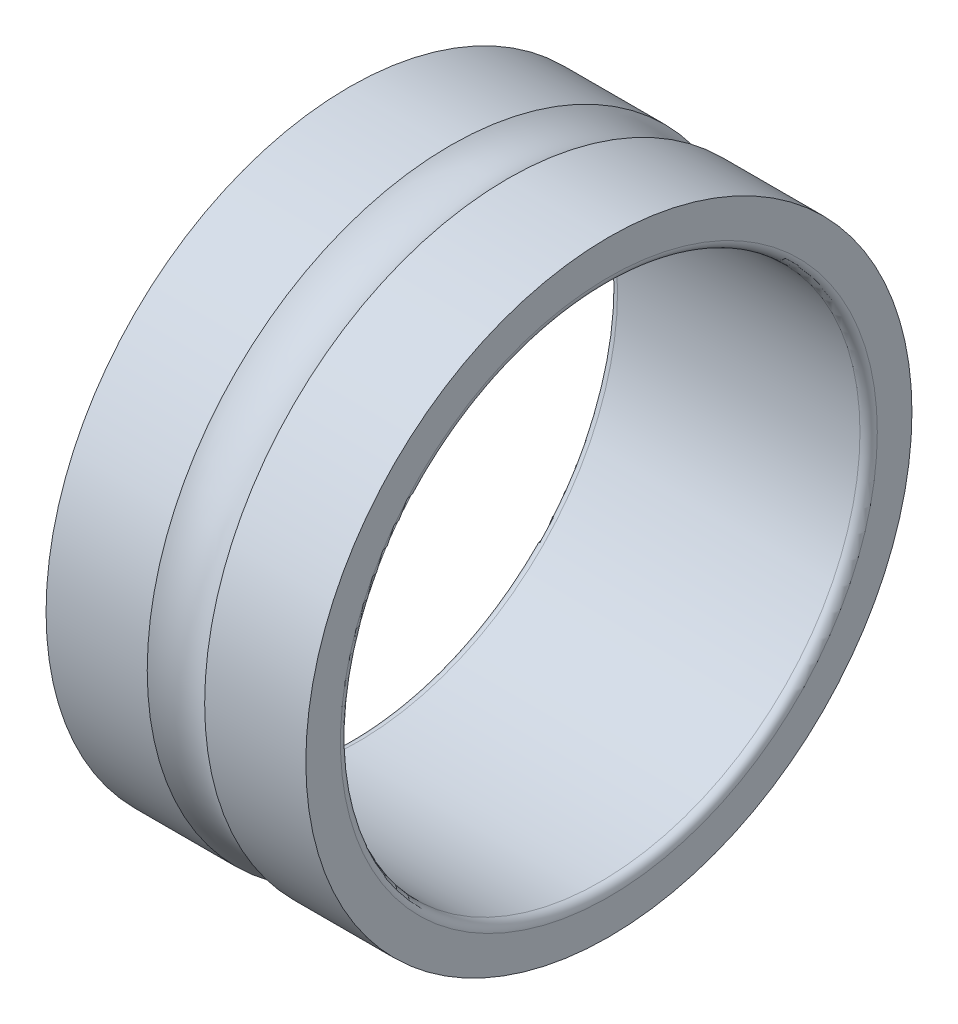
ISO-10303-21;
HEADER;
FILE_DESCRIPTION(('STEP AP214'),'2;1');
FILE_NAME('part.step','',(''),(''),'','','');
FILE_SCHEMA(('AUTOMOTIVE_DESIGN { 1 0 10303 214 1 1 1 1 }'));
ENDSEC;
DATA;
#1=APPLICATION_CONTEXT('core data for automotive mechanical design processes');
#2=APPLICATION_PROTOCOL_DEFINITION('international standard','automotive_design',2000,#1);
#3=PRODUCT_CONTEXT('',#1,'mechanical');
#4=PRODUCT('Part','Part','',(#3));
#5=PRODUCT_RELATED_PRODUCT_CATEGORY('part','',(#4));
#6=PRODUCT_DEFINITION_FORMATION('','',#4);
#7=PRODUCT_DEFINITION_CONTEXT('part definition',#1,'design');
#8=PRODUCT_DEFINITION('design','',#6,#7);
#9=PRODUCT_DEFINITION_SHAPE('','',#8);
#10=(LENGTH_UNIT() NAMED_UNIT(*) SI_UNIT(.MILLI.,.METRE.));
#11=(NAMED_UNIT(*) PLANE_ANGLE_UNIT() SI_UNIT($,.RADIAN.));
#12=(NAMED_UNIT(*) SI_UNIT($,.STERADIAN.) SOLID_ANGLE_UNIT());
#13=UNCERTAINTY_MEASURE_WITH_UNIT(LENGTH_MEASURE(1.E-05),#10,'distance_accuracy_value','');
#14=(GEOMETRIC_REPRESENTATION_CONTEXT(3) GLOBAL_UNCERTAINTY_ASSIGNED_CONTEXT((#13)) GLOBAL_UNIT_ASSIGNED_CONTEXT((#10,
#11,#12)) REPRESENTATION_CONTEXT('',''));
#15=CARTESIAN_POINT('',(0.,0.,0.));
#16=DIRECTION('',(0.,0.,1.));
#17=DIRECTION('',(1.,0.,0.));
#18=AXIS2_PLACEMENT_3D('',#15,#16,#17);
#19=CARTESIAN_POINT('',(0.,3.5,0.));
#20=DIRECTION('',(-1.,0.,0.));
#21=DIRECTION('',(0.,0.,1.));
#22=AXIS2_PLACEMENT_3D('',#19,#20,#21);
#23=PLANE('',#22);
#24=CARTESIAN_POINT('',(0.,0.,0.));
#25=DIRECTION('',(1.,0.,0.));
#26=DIRECTION('',(0.,0.,-1.));
#27=AXIS2_PLACEMENT_3D('',#24,#25,#26);
#28=CIRCLE('',#27,3.09999999999993);
#29=CARTESIAN_POINT('',(0.,0.,-3.09999999999993));
#30=VERTEX_POINT('',#29);
#31=EDGE_CURVE('E5',#30,#30,#28,.T.);
#32=ORIENTED_EDGE('',*,*,#31,.T.);
#33=EDGE_LOOP('',(#32));
#34=FACE_BOUND('',#33,.T.);
#35=CARTESIAN_POINT('',(0.,0.,0.));
#36=DIRECTION('',(1.,0.,0.));
#37=DIRECTION('',(0.,0.,-1.));
#38=AXIS2_PLACEMENT_3D('',#35,#36,#37);
#39=CIRCLE('',#38,3.5);
#40=CARTESIAN_POINT('',(0.,0.,-3.5));
#41=VERTEX_POINT('',#40);
#42=EDGE_CURVE('E9',#41,#41,#39,.T.);
#43=ORIENTED_EDGE('',*,*,#42,.F.);
#44=EDGE_LOOP('',(#43));
#45=FACE_BOUND('',#44,.T.);
#46=ADVANCED_FACE('F13',(#34,#45),#23,.T.);
#47=CARTESIAN_POINT('',(0.099999999999923,0.,0.));
#48=DIRECTION('',(1.,0.,0.));
#49=DIRECTION('',(0.,0.,-1.));
#50=AXIS2_PLACEMENT_3D('',#47,#48,#49);
#51=TOROIDAL_SURFACE('',#50,3.09999999999993,0.099999999999923);
#52=CARTESIAN_POINT('',(0.1,0.,0.));
#53=DIRECTION('',(1.,0.,0.));
#54=DIRECTION('',(0.,0.,-1.));
#55=AXIS2_PLACEMENT_3D('',#52,#53,#54);
#56=CIRCLE('',#55,3.);
#57=CARTESIAN_POINT('',(0.1,0.,-3.));
#58=VERTEX_POINT('',#57);
#59=EDGE_CURVE('E24',#58,#58,#56,.T.);
#60=ORIENTED_EDGE('',*,*,#59,.T.);
#61=EDGE_LOOP('',(#60));
#62=FACE_BOUND('',#61,.T.);
#63=ORIENTED_EDGE('',*,*,#31,.F.);
#64=EDGE_LOOP('',(#63));
#65=FACE_BOUND('',#64,.T.);
#66=ADVANCED_FACE('F30',(#62,#65),#51,.T.);
#67=CARTESIAN_POINT('',(3.,0.,0.));
#68=DIRECTION('',(1.,0.,0.));
#69=DIRECTION('',(0.,0.,-1.));
#70=AXIS2_PLACEMENT_3D('',#67,#68,#69);
#71=CYLINDRICAL_SURFACE('',#70,3.5);
#72=ORIENTED_EDGE('',*,*,#42,.T.);
#73=EDGE_LOOP('',(#72));
#74=FACE_BOUND('',#73,.T.);
#75=CARTESIAN_POINT('',(1.1683375209645,0.,0.));
#76=DIRECTION('',(1.,0.,0.));
#77=DIRECTION('',(0.,0.,-1.));
#78=AXIS2_PLACEMENT_3D('',#75,#76,#77);
#79=CIRCLE('',#78,3.5);
#80=CARTESIAN_POINT('',(1.1683375209645,0.,-3.5));
#81=VERTEX_POINT('',#80);
#82=EDGE_CURVE('E39',#81,#81,#79,.T.);
#83=ORIENTED_EDGE('',*,*,#82,.F.);
#84=EDGE_LOOP('',(#83));
#85=FACE_BOUND('',#84,.T.);
#86=ADVANCED_FACE('F43',(#74,#85),#71,.T.);
#87=CARTESIAN_POINT('',(3.,0.,0.));
#88=DIRECTION('',(1.,0.,0.));
#89=DIRECTION('',(0.,0.,-1.));
#90=AXIS2_PLACEMENT_3D('',#87,#88,#89);
#91=CYLINDRICAL_SURFACE('',#90,3.);
#92=CARTESIAN_POINT('',(2.9,0.,0.));
#93=DIRECTION('',(1.,0.,0.));
#94=DIRECTION('',(0.,0.,-1.));
#95=AXIS2_PLACEMENT_3D('',#92,#93,#94);
#96=CIRCLE('',#95,3.);
#97=CARTESIAN_POINT('',(2.9,0.,-3.));
#98=VERTEX_POINT('',#97);
#99=EDGE_CURVE('E50',#98,#98,#96,.T.);
#100=ORIENTED_EDGE('',*,*,#99,.T.);
#101=EDGE_LOOP('',(#100));
#102=FACE_BOUND('',#101,.T.);
#103=ORIENTED_EDGE('',*,*,#59,.F.);
#104=EDGE_LOOP('',(#103));
#105=FACE_BOUND('',#104,.T.);
#106=ADVANCED_FACE('F56',(#102,#105),#91,.F.);
#107=CARTESIAN_POINT('',(1.5,0.,0.));
#108=DIRECTION('',(1.,0.,0.));
#109=DIRECTION('',(0.,0.,-1.));
#110=AXIS2_PLACEMENT_3D('',#107,#108,#109);
#111=TOROIDAL_SURFACE('',#110,3.99999999999986,0.599999999999866);
#112=CARTESIAN_POINT('',(1.8316624790355,0.,0.));
#113=DIRECTION('',(1.,0.,0.));
#114=DIRECTION('',(0.,0.,-1.));
#115=AXIS2_PLACEMENT_3D('',#112,#113,#114);
#116=CIRCLE('',#115,3.5);
#117=CARTESIAN_POINT('',(1.8316624790355,0.,-3.5));
#118=VERTEX_POINT('',#117);
#119=EDGE_CURVE('E63',#118,#118,#116,.T.);
#120=ORIENTED_EDGE('',*,*,#119,.F.);
#121=EDGE_LOOP('',(#120));
#122=FACE_BOUND('',#121,.T.);
#123=ORIENTED_EDGE('',*,*,#82,.T.);
#124=EDGE_LOOP('',(#123));
#125=FACE_BOUND('',#124,.T.);
#126=ADVANCED_FACE('F69',(#122,#125),#111,.F.);
#127=CARTESIAN_POINT('',(2.90000000000015,0.,0.));
#128=DIRECTION('',(1.,0.,0.));
#129=DIRECTION('',(0.,0.,-1.));
#130=AXIS2_PLACEMENT_3D('',#127,#128,#129);
#131=TOROIDAL_SURFACE('',#130,3.09999999999985,0.0999999999998467);
#132=CARTESIAN_POINT('',(3.,0.,0.));
#133=DIRECTION('',(1.,0.,0.));
#134=DIRECTION('',(0.,0.,-1.));
#135=AXIS2_PLACEMENT_3D('',#132,#133,#134);
#136=CIRCLE('',#135,3.10000001788124);
#137=CARTESIAN_POINT('',(3.,0.,-3.10000001788124));
#138=VERTEX_POINT('',#137);
#139=EDGE_CURVE('E76',#138,#138,#136,.T.);
#140=ORIENTED_EDGE('',*,*,#139,.T.);
#141=EDGE_LOOP('',(#140));
#142=FACE_BOUND('',#141,.T.);
#143=ORIENTED_EDGE('',*,*,#99,.F.);
#144=EDGE_LOOP('',(#143));
#145=FACE_BOUND('',#144,.T.);
#146=ADVANCED_FACE('F82',(#142,#145),#131,.T.);
#147=CARTESIAN_POINT('',(3.,0.,0.));
#148=DIRECTION('',(1.,0.,0.));
#149=DIRECTION('',(0.,0.,-1.));
#150=AXIS2_PLACEMENT_3D('',#147,#148,#149);
#151=CYLINDRICAL_SURFACE('',#150,3.5);
#152=ORIENTED_EDGE('',*,*,#119,.T.);
#153=EDGE_LOOP('',(#152));
#154=FACE_BOUND('',#153,.T.);
#155=CARTESIAN_POINT('',(3.,0.,0.));
#156=DIRECTION('',(1.,0.,0.));
#157=DIRECTION('',(0.,0.,-1.));
#158=AXIS2_PLACEMENT_3D('',#155,#156,#157);
#159=CIRCLE('',#158,3.5);
#160=CARTESIAN_POINT('',(3.,0.,-3.5));
#161=VERTEX_POINT('',#160);
#162=EDGE_CURVE('E91',#161,#161,#159,.T.);
#163=ORIENTED_EDGE('',*,*,#162,.F.);
#164=EDGE_LOOP('',(#163));
#165=FACE_BOUND('',#164,.T.);
#166=ADVANCED_FACE('F95',(#154,#165),#151,.T.);
#167=CARTESIAN_POINT('',(3.,3.1,0.));
#168=DIRECTION('',(1.,0.,0.));
#169=DIRECTION('',(0.,0.,-1.));
#170=AXIS2_PLACEMENT_3D('',#167,#168,#169);
#171=PLANE('',#170);
#172=ORIENTED_EDGE('',*,*,#162,.T.);
#173=EDGE_LOOP('',(#172));
#174=FACE_BOUND('',#173,.T.);
#175=ORIENTED_EDGE('',*,*,#139,.F.);
#176=EDGE_LOOP('',(#175));
#177=FACE_BOUND('',#176,.T.);
#178=ADVANCED_FACE('F106',(#174,#177),#171,.T.);
#179=CLOSED_SHELL('',(#46,#66,#86,#106,#126,#146,#166,#178));
#180=MANIFOLD_SOLID_BREP('B1',#179);
#181=ADVANCED_BREP_SHAPE_REPRESENTATION('',(#18,#180),#14);
#182=SHAPE_DEFINITION_REPRESENTATION(#9,#181);
ENDSEC;
END-ISO-10303-21;
